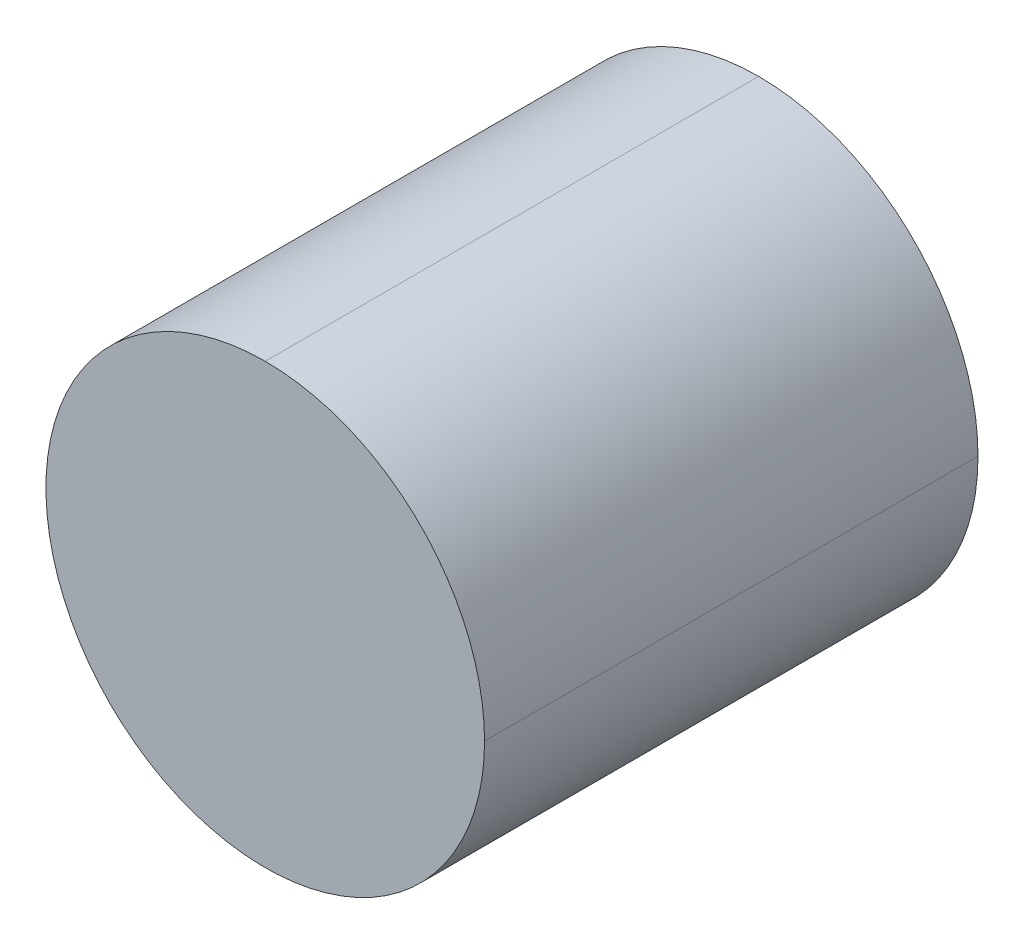
ISO-10303-21;
HEADER;
FILE_DESCRIPTION(('STEP AP214'),'2;1');
FILE_NAME('part.step','',(''),(''),'','','');
FILE_SCHEMA(('AUTOMOTIVE_DESIGN { 1 0 10303 214 1 1 1 1 }'));
ENDSEC;
DATA;
#1=APPLICATION_CONTEXT('core data for automotive mechanical design processes');
#2=APPLICATION_PROTOCOL_DEFINITION('international standard','automotive_design',2000,#1);
#3=PRODUCT_CONTEXT('',#1,'mechanical');
#4=PRODUCT('Part','Part','',(#3));
#5=PRODUCT_RELATED_PRODUCT_CATEGORY('part','',(#4));
#6=PRODUCT_DEFINITION_FORMATION('','',#4);
#7=PRODUCT_DEFINITION_CONTEXT('part definition',#1,'design');
#8=PRODUCT_DEFINITION('design','',#6,#7);
#9=PRODUCT_DEFINITION_SHAPE('','',#8);
#10=(LENGTH_UNIT() NAMED_UNIT(*) SI_UNIT(.MILLI.,.METRE.));
#11=(NAMED_UNIT(*) PLANE_ANGLE_UNIT() SI_UNIT($,.RADIAN.));
#12=(NAMED_UNIT(*) SI_UNIT($,.STERADIAN.) SOLID_ANGLE_UNIT());
#13=UNCERTAINTY_MEASURE_WITH_UNIT(LENGTH_MEASURE(1.E-05),#10,'distance_accuracy_value','');
#14=(GEOMETRIC_REPRESENTATION_CONTEXT(3) GLOBAL_UNCERTAINTY_ASSIGNED_CONTEXT((#13)) GLOBAL_UNIT_ASSIGNED_CONTEXT((#10,
#11,#12)) REPRESENTATION_CONTEXT('',''));
#15=CARTESIAN_POINT('',(0.,0.,0.));
#16=DIRECTION('',(0.,0.,1.));
#17=DIRECTION('',(1.,0.,0.));
#18=AXIS2_PLACEMENT_3D('',#15,#16,#17);
#19=CARTESIAN_POINT('',(0.,92.62,9.));
#20=DIRECTION('',(0.,0.,1.));
#21=DIRECTION('',(1.,0.,0.));
#22=AXIS2_PLACEMENT_3D('',#19,#20,#21);
#23=PLANE('',#22);
#24=CARTESIAN_POINT('',(0.,92.62,9.));
#25=DIRECTION('',(0.,0.,1.));
#26=DIRECTION('',(1.,0.,0.));
#27=AXIS2_PLACEMENT_3D('',#24,#25,#26);
#28=CIRCLE('',#27,2.1);
#29=CARTESIAN_POINT('',(2.1,92.62,9.));
#30=VERTEX_POINT('',#29);
#31=EDGE_CURVE('E10',#30,#30,#28,.T.);
#32=ORIENTED_EDGE('',*,*,#31,.F.);
#33=EDGE_LOOP('',(#32));
#34=FACE_BOUND('',#33,.T.);
#35=ADVANCED_FACE('F16',(#34),#23,.F.);
#36=CARTESIAN_POINT('',(0.,92.62,3.));
#37=DIRECTION('',(0.,0.,-1.));
#38=DIRECTION('',(1.,0.,0.));
#39=AXIS2_PLACEMENT_3D('',#36,#37,#38);
#40=CYLINDRICAL_SURFACE('',#39,2.1);
#41=DIRECTION('',(0.,0.,1.));
#42=VECTOR('',#41,1.);
#43=CARTESIAN_POINT('',(2.1,92.62,3.));
#44=LINE('',#43,#42);
#45=CARTESIAN_POINT('',(2.1,92.62,3.));
#46=VERTEX_POINT('',#45);
#47=EDGE_CURVE('E24',#46,#30,#44,.T.);
#48=ORIENTED_EDGE('',*,*,#47,.T.);
#49=ORIENTED_EDGE('',*,*,#31,.T.);
#50=ORIENTED_EDGE('',*,*,#47,.F.);
#51=CARTESIAN_POINT('',(0.,92.62,3.));
#52=DIRECTION('',(0.,0.,1.));
#53=DIRECTION('',(1.,0.,0.));
#54=AXIS2_PLACEMENT_3D('',#51,#52,#53);
#55=CIRCLE('',#54,2.1);
#56=EDGE_CURVE('E70',#46,#46,#55,.T.);
#57=ORIENTED_EDGE('',*,*,#56,.F.);
#58=EDGE_LOOP('',(#48,#49,#50,#57));
#59=FACE_BOUND('',#58,.T.);
#60=ADVANCED_FACE('F94',(#59),#40,.F.);
#61=CARTESIAN_POINT('',(0.,92.62,3.));
#62=DIRECTION('',(0.,0.,1.));
#63=DIRECTION('',(1.,0.,0.));
#64=AXIS2_PLACEMENT_3D('',#61,#62,#63);
#65=PLANE('',#64);
#66=ORIENTED_EDGE('',*,*,#56,.T.);
#67=EDGE_LOOP('',(#66));
#68=FACE_BOUND('',#67,.T.);
#69=CARTESIAN_POINT('',(0.,92.62,3.));
#70=DIRECTION('',(0.,0.,1.));
#71=DIRECTION('',(1.,0.,0.));
#72=AXIS2_PLACEMENT_3D('',#69,#70,#71);
#73=CIRCLE('',#72,4.);
#74=CARTESIAN_POINT('',(0.,96.62,3.));
#75=VERTEX_POINT('',#74);
#76=CARTESIAN_POINT('',(4.,92.62,3.));
#77=VERTEX_POINT('',#76);
#78=EDGE_CURVE('E59',#75,#77,#73,.T.);
#79=ORIENTED_EDGE('',*,*,#78,.F.);
#80=CARTESIAN_POINT('',(0.,92.62,3.));
#81=DIRECTION('',(0.,0.,1.));
#82=DIRECTION('',(1.,0.,0.));
#83=AXIS2_PLACEMENT_3D('',#80,#81,#82);
#84=CIRCLE('',#83,4.);
#85=EDGE_CURVE('E61',#77,#75,#84,.T.);
#86=ORIENTED_EDGE('',*,*,#85,.F.);
#87=EDGE_LOOP('',(#79,#86));
#88=FACE_BOUND('',#87,.T.);
#89=ADVANCED_FACE('F58',(#68,#88),#65,.F.);
#90=CARTESIAN_POINT('',(0.,92.62,3.));
#91=DIRECTION('',(0.,0.,-1.));
#92=DIRECTION('',(1.,0.,0.));
#93=AXIS2_PLACEMENT_3D('',#90,#91,#92);
#94=CYLINDRICAL_SURFACE('',#93,4.);
#95=CARTESIAN_POINT('',(0.,92.62,12.));
#96=DIRECTION('',(0.,0.,1.));
#97=DIRECTION('',(1.,0.,0.));
#98=AXIS2_PLACEMENT_3D('',#95,#96,#97);
#99=CIRCLE('',#98,4.);
#100=CARTESIAN_POINT('',(0.,96.62,12.));
#101=VERTEX_POINT('',#100);
#102=CARTESIAN_POINT('',(4.,92.62,12.));
#103=VERTEX_POINT('',#102);
#104=EDGE_CURVE('E68',#101,#103,#99,.T.);
#105=ORIENTED_EDGE('',*,*,#104,.F.);
#106=DIRECTION('',(0.,0.,-1.));
#107=VECTOR('',#106,1.);
#108=CARTESIAN_POINT('',(0.,96.62,3.));
#109=LINE('',#108,#107);
#110=EDGE_CURVE('E72',#101,#75,#109,.T.);
#111=ORIENTED_EDGE('',*,*,#110,.T.);
#112=ORIENTED_EDGE('',*,*,#78,.T.);
#113=DIRECTION('',(0.,0.,1.));
#114=VECTOR('',#113,1.);
#115=CARTESIAN_POINT('',(4.,92.62,3.));
#116=LINE('',#115,#114);
#117=EDGE_CURVE('E74',#77,#103,#116,.T.);
#118=ORIENTED_EDGE('',*,*,#117,.T.);
#119=EDGE_LOOP('',(#105,#111,#112,#118));
#120=FACE_BOUND('',#119,.T.);
#121=ADVANCED_FACE('F77',(#120),#94,.T.);
#122=CARTESIAN_POINT('',(0.,92.62,12.));
#123=DIRECTION('',(0.,0.,1.));
#124=DIRECTION('',(1.,0.,0.));
#125=AXIS2_PLACEMENT_3D('',#122,#123,#124);
#126=PLANE('',#125);
#127=CARTESIAN_POINT('',(0.,92.62,12.));
#128=DIRECTION('',(0.,0.,1.));
#129=DIRECTION('',(1.,0.,0.));
#130=AXIS2_PLACEMENT_3D('',#127,#128,#129);
#131=CIRCLE('',#130,4.);
#132=EDGE_CURVE('E82',#103,#101,#131,.T.);
#133=ORIENTED_EDGE('',*,*,#132,.T.);
#134=ORIENTED_EDGE('',*,*,#104,.T.);
#135=EDGE_LOOP('',(#133,#134));
#136=FACE_BOUND('',#135,.T.);
#137=ADVANCED_FACE('F102',(#136),#126,.T.);
#138=CARTESIAN_POINT('',(0.,92.62,3.));
#139=DIRECTION('',(0.,0.,-1.));
#140=DIRECTION('',(1.,0.,0.));
#141=AXIS2_PLACEMENT_3D('',#138,#139,#140);
#142=CYLINDRICAL_SURFACE('',#141,4.);
#143=ORIENTED_EDGE('',*,*,#110,.F.);
#144=ORIENTED_EDGE('',*,*,#132,.F.);
#145=ORIENTED_EDGE('',*,*,#117,.F.);
#146=ORIENTED_EDGE('',*,*,#85,.T.);
#147=EDGE_LOOP('',(#143,#144,#145,#146));
#148=FACE_BOUND('',#147,.T.);
#149=ADVANCED_FACE('F71',(#148),#142,.T.);
#150=CLOSED_SHELL('',(#35,#60,#89,#121,#137,#149));
#151=MANIFOLD_SOLID_BREP('B1',#150);
#152=ADVANCED_BREP_SHAPE_REPRESENTATION('',(#18,#151),#14);
#153=SHAPE_DEFINITION_REPRESENTATION(#9,#152);
ENDSEC;
END-ISO-10303-21;
